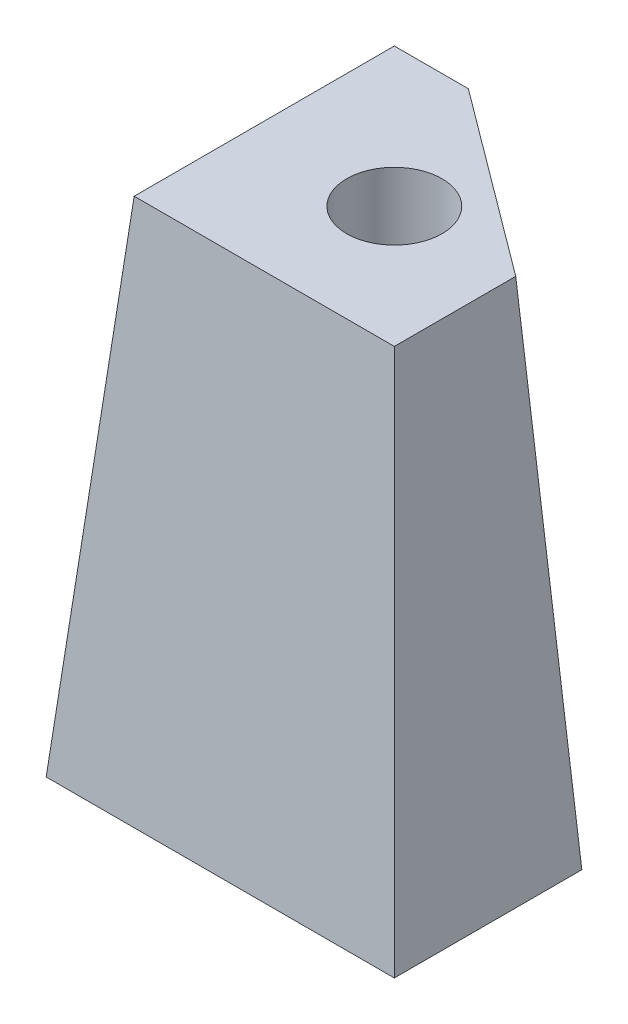
ISO-10303-21;
HEADER;
FILE_DESCRIPTION(('STEP AP214'),'2;1');
FILE_NAME('part.step','',(''),(''),'','','');
FILE_SCHEMA(('AUTOMOTIVE_DESIGN { 1 0 10303 214 1 1 1 1 }'));
ENDSEC;
DATA;
#1=APPLICATION_CONTEXT('core data for automotive mechanical design processes');
#2=APPLICATION_PROTOCOL_DEFINITION('international standard','automotive_design',2000,#1);
#3=PRODUCT_CONTEXT('',#1,'mechanical');
#4=PRODUCT('Part','Part','',(#3));
#5=PRODUCT_RELATED_PRODUCT_CATEGORY('part','',(#4));
#6=PRODUCT_DEFINITION_FORMATION('','',#4);
#7=PRODUCT_DEFINITION_CONTEXT('part definition',#1,'design');
#8=PRODUCT_DEFINITION('design','',#6,#7);
#9=PRODUCT_DEFINITION_SHAPE('','',#8);
#10=(LENGTH_UNIT() NAMED_UNIT(*) SI_UNIT(.MILLI.,.METRE.));
#11=(NAMED_UNIT(*) PLANE_ANGLE_UNIT() SI_UNIT($,.RADIAN.));
#12=(NAMED_UNIT(*) SI_UNIT($,.STERADIAN.) SOLID_ANGLE_UNIT());
#13=UNCERTAINTY_MEASURE_WITH_UNIT(LENGTH_MEASURE(1.E-05),#10,'distance_accuracy_value','');
#14=(GEOMETRIC_REPRESENTATION_CONTEXT(3) GLOBAL_UNCERTAINTY_ASSIGNED_CONTEXT((#13)) GLOBAL_UNIT_ASSIGNED_CONTEXT((#10,
#11,#12)) REPRESENTATION_CONTEXT('',''));
#15=CARTESIAN_POINT('',(0.,0.,0.));
#16=DIRECTION('',(0.,0.,1.));
#17=DIRECTION('',(1.,0.,0.));
#18=AXIS2_PLACEMENT_3D('',#15,#16,#17);
#19=CARTESIAN_POINT('',(-4.57964601769912,29.,-7.79867256637168));
#20=DIRECTION('',(0.,0.0871557427476584,-0.996194698091746));
#21=DIRECTION('',(0.,0.996194698091746,0.0871557427476584));
#22=AXIS2_PLACEMENT_3D('',#19,#20,#21);
#23=PLANE('',#22);
#24=DIRECTION('',(1.,0.,0.));
#25=VECTOR('',#24,1.);
#26=CARTESIAN_POINT('',(0.,0.,-10.3358438086235));
#27=LINE('',#26,#25);
#28=CARTESIAN_POINT('',(0.529076734468533,0.,-10.3358438086235));
#29=VERTEX_POINT('',#28);
#30=CARTESIAN_POINT('',(-7.11681725995092,0.,-10.3358438086235));
#31=VERTEX_POINT('',#30);
#32=EDGE_CURVE('E43',#29,#31,#27,.F.);
#33=ORIENTED_EDGE('',*,*,#32,.T.);
#34=DIRECTION('',(-0.0868265938642478,-0.992432509138967,-0.0868265938642478));
#35=VECTOR('',#34,1.);
#36=CARTESIAN_POINT('',(-4.46656315666811,30.2925430161303,-7.68558970534068));
#37=LINE('',#36,#35);
#38=CARTESIAN_POINT('',(-4.57964601769912,29.,-7.79867256637168));
#39=VERTEX_POINT('',#38);
#40=EDGE_CURVE('E11',#39,#31,#37,.T.);
#41=ORIENTED_EDGE('',*,*,#40,.F.);
#42=DIRECTION('',(-1.,0.,0.));
#43=VECTOR('',#42,1.);
#44=CARTESIAN_POINT('',(-4.57964601769912,29.,-7.79867256637168));
#45=LINE('',#44,#43);
#46=CARTESIAN_POINT('',(-0.312469404417813,29.,-7.79867256637168));
#47=VERTEX_POINT('',#46);
#48=EDGE_CURVE('E114',#47,#39,#45,.T.);
#49=ORIENTED_EDGE('',*,*,#48,.F.);
#50=DIRECTION('',(0.0288963352029624,-0.995778700850393,-0.087119347704982));
#51=VECTOR('',#50,1.);
#52=CARTESIAN_POINT('',(-0.316032489158469,29.1227852552634,-7.787930248488));
#53=LINE('',#52,#51);
#54=EDGE_CURVE('E92',#47,#29,#53,.T.);
#55=ORIENTED_EDGE('',*,*,#54,.T.);
#56=EDGE_LOOP('',(#33,#41,#49,#55));
#57=FACE_BOUND('',#56,.T.);
#58=ADVANCED_FACE('F39',(#57),#23,.T.);
#59=CARTESIAN_POINT('',(-4.57964601769912,29.,7.20132743362832));
#60=DIRECTION('',(-0.996194698091746,0.0871557427476584,0.));
#61=DIRECTION('',(0.0871557427476584,0.996194698091746,0.));
#62=AXIS2_PLACEMENT_3D('',#59,#60,#61);
#63=PLANE('',#62);
#64=DIRECTION('',(0.,0.,-1.));
#65=VECTOR('',#64,1.);
#66=CARTESIAN_POINT('',(-7.11681725995092,0.,0.));
#67=LINE('',#66,#65);
#68=CARTESIAN_POINT('',(-7.11681725995092,0.,9.73849867588012));
#69=VERTEX_POINT('',#68);
#70=EDGE_CURVE('E80',#31,#69,#67,.F.);
#71=ORIENTED_EDGE('',*,*,#70,.T.);
#72=DIRECTION('',(-0.0868265938642478,-0.992432509138967,0.0868265938642478));
#73=VECTOR('',#72,1.);
#74=CARTESIAN_POINT('',(-4.46656315666811,30.2925430161303,7.08824457259731));
#75=LINE('',#74,#73);
#76=CARTESIAN_POINT('',(-4.57964601769912,29.,7.20132743362832));
#77=VERTEX_POINT('',#76);
#78=EDGE_CURVE('E47',#77,#69,#75,.T.);
#79=ORIENTED_EDGE('',*,*,#78,.F.);
#80=DIRECTION('',(0.,0.,1.));
#81=VECTOR('',#80,1.);
#82=CARTESIAN_POINT('',(-4.57964601769912,29.,7.20132743362832));
#83=LINE('',#82,#81);
#84=EDGE_CURVE('E93',#39,#77,#83,.T.);
#85=ORIENTED_EDGE('',*,*,#84,.F.);
#86=ORIENTED_EDGE('',*,*,#40,.T.);
#87=EDGE_LOOP('',(#71,#79,#85,#86));
#88=FACE_BOUND('',#87,.T.);
#89=ADVANCED_FACE('F88',(#88),#63,.T.);
#90=CARTESIAN_POINT('',(10.4203539823009,29.,7.20132743362832));
#91=DIRECTION('',(0.,0.0871557427476584,0.996194698091746));
#92=DIRECTION('',(0.,0.996194698091746,-0.0871557427476584));
#93=AXIS2_PLACEMENT_3D('',#90,#91,#92);
#94=PLANE('',#93);
#95=DIRECTION('',(-1.,0.,0.));
#96=VECTOR('',#95,1.);
#97=CARTESIAN_POINT('',(0.,0.,9.73849867588012));
#98=LINE('',#97,#96);
#99=CARTESIAN_POINT('',(12.9575252245527,0.,9.73849867588012));
#100=VERTEX_POINT('',#99);
#101=EDGE_CURVE('E85',#69,#100,#98,.F.);
#102=ORIENTED_EDGE('',*,*,#101,.T.);
#103=DIRECTION('',(0.0868265938642478,-0.992432509138967,0.0868265938642478));
#104=VECTOR('',#103,1.);
#105=CARTESIAN_POINT('',(10.3675819804864,29.6031867408608,7.14855543181385));
#106=LINE('',#105,#104);
#107=CARTESIAN_POINT('',(10.4203539823009,29.,7.20132743362832));
#108=VERTEX_POINT('',#107);
#109=EDGE_CURVE('E129',#108,#100,#106,.T.);
#110=ORIENTED_EDGE('',*,*,#109,.F.);
#111=DIRECTION('',(1.,0.,0.));
#112=VECTOR('',#111,1.);
#113=CARTESIAN_POINT('',(10.4203539823009,29.,7.20132743362832));
#114=LINE('',#113,#112);
#115=EDGE_CURVE('E118',#77,#108,#114,.T.);
#116=ORIENTED_EDGE('',*,*,#115,.F.);
#117=ORIENTED_EDGE('',*,*,#78,.T.);
#118=EDGE_LOOP('',(#102,#110,#116,#117));
#119=FACE_BOUND('',#118,.T.);
#120=ADVANCED_FACE('F41',(#119),#94,.T.);
#121=CARTESIAN_POINT('',(10.4203539823009,29.,0.201327433628314));
#122=DIRECTION('',(0.996194698091746,0.0871557427476584,0.));
#123=DIRECTION('',(-0.0871557427476584,0.996194698091746,0.));
#124=AXIS2_PLACEMENT_3D('',#121,#122,#123);
#125=PLANE('',#124);
#126=DIRECTION('',(0.,0.,1.));
#127=VECTOR('',#126,1.);
#128=CARTESIAN_POINT('',(12.9575252245527,0.,0.));
#129=LINE('',#128,#127);
#130=CARTESIAN_POINT('',(12.9575252245527,0.,-1.0719638081653));
#131=VERTEX_POINT('',#130);
#132=EDGE_CURVE('E131',#100,#131,#129,.F.);
#133=ORIENTED_EDGE('',*,*,#132,.T.);
#134=DIRECTION('',(0.0870724913818913,-0.995243130626751,-0.0436977366097346));
#135=VECTOR('',#134,1.);
#136=CARTESIAN_POINT('',(10.3694207735681,29.5821692397634,0.226888502394943));
#137=LINE('',#136,#135);
#138=CARTESIAN_POINT('',(10.4203539823009,29.,0.201327433628314));
#139=VERTEX_POINT('',#138);
#140=EDGE_CURVE('E127',#139,#131,#137,.T.);
#141=ORIENTED_EDGE('',*,*,#140,.F.);
#142=DIRECTION('',(0.,0.,-1.));
#143=VECTOR('',#142,1.);
#144=CARTESIAN_POINT('',(10.4203539823009,29.,0.201327433628314));
#145=LINE('',#144,#143);
#146=EDGE_CURVE('E125',#108,#139,#145,.T.);
#147=ORIENTED_EDGE('',*,*,#146,.F.);
#148=ORIENTED_EDGE('',*,*,#109,.T.);
#149=EDGE_LOOP('',(#133,#141,#147,#148));
#150=FACE_BOUND('',#149,.T.);
#151=ADVANCED_FACE('F145',(#150),#125,.T.);
#152=CARTESIAN_POINT('',(-0.312469404417813,29.,-7.79867256637168));
#153=DIRECTION('',(0.595351002863312,0.0871557427476584,-0.798724645854723));
#154=DIRECTION('',(-0.0520864635693298,0.996194698091746,0.0698793517910468));
#155=AXIS2_PLACEMENT_3D('',#152,#153,#154);
#156=PLANE('',#155);
#157=DIRECTION('',(0.801775644243756,0.,0.597625146975519));
#158=VECTOR('',#157,1.);
#159=CARTESIAN_POINT('',(5.1414990569579,0.,-6.89785016516374));
#160=LINE('',#159,#158);
#161=EDGE_CURVE('E120',#131,#29,#160,.F.);
#162=ORIENTED_EDGE('',*,*,#161,.T.);
#163=ORIENTED_EDGE('',*,*,#54,.F.);
#164=DIRECTION('',(-0.801775644243756,0.,-0.597625146975519));
#165=VECTOR('',#164,1.);
#166=CARTESIAN_POINT('',(-0.312469404417813,29.,-7.79867256637168));
#167=LINE('',#166,#165);
#168=EDGE_CURVE('E59',#139,#47,#167,.T.);
#169=ORIENTED_EDGE('',*,*,#168,.F.);
#170=ORIENTED_EDGE('',*,*,#140,.T.);
#171=EDGE_LOOP('',(#162,#163,#169,#170));
#172=FACE_BOUND('',#171,.T.);
#173=ADVANCED_FACE('F143',(#172),#156,.T.);
#174=CARTESIAN_POINT('',(0.,29.,0.));
#175=DIRECTION('',(0.,-1.,0.));
#176=DIRECTION('',(0.,0.,-1.));
#177=AXIS2_PLACEMENT_3D('',#174,#175,#176);
#178=PLANE('',#177);
#179=CARTESIAN_POINT('',(3.42035398230088,29.,0.201327433628316));
#180=DIRECTION('',(0.,1.,0.));
#181=DIRECTION('',(0.,0.,1.));
#182=AXIS2_PLACEMENT_3D('',#179,#180,#181);
#183=CIRCLE('',#182,2.75);
#184=CARTESIAN_POINT('',(3.42035398230088,29.,2.95132743362832));
#185=VERTEX_POINT('',#184);
#186=EDGE_CURVE('E106',#185,#185,#183,.T.);
#187=ORIENTED_EDGE('',*,*,#186,.F.);
#188=EDGE_LOOP('',(#187));
#189=FACE_BOUND('',#188,.T.);
#190=ORIENTED_EDGE('',*,*,#48,.T.);
#191=ORIENTED_EDGE('',*,*,#84,.T.);
#192=ORIENTED_EDGE('',*,*,#115,.T.);
#193=ORIENTED_EDGE('',*,*,#146,.T.);
#194=ORIENTED_EDGE('',*,*,#168,.T.);
#195=EDGE_LOOP('',(#190,#191,#192,#193,#194));
#196=FACE_BOUND('',#195,.T.);
#197=ADVANCED_FACE('F146',(#189,#196),#178,.F.);
#198=CARTESIAN_POINT('',(0.,0.,0.));
#199=DIRECTION('',(0.,-1.,0.));
#200=DIRECTION('',(0.,0.,-1.));
#201=AXIS2_PLACEMENT_3D('',#198,#199,#200);
#202=PLANE('',#201);
#203=CARTESIAN_POINT('',(-0.579646017699118,0.,2.20132743362832));
#204=DIRECTION('',(0.,-1.,0.));
#205=DIRECTION('',(0.,0.,-1.));
#206=AXIS2_PLACEMENT_3D('',#203,#204,#205);
#207=CIRCLE('',#206,2.);
#208=CARTESIAN_POINT('',(-0.579646017699118,0.,0.201327433628316));
#209=VERTEX_POINT('',#208);
#210=EDGE_CURVE('E96',#209,#209,#207,.T.);
#211=ORIENTED_EDGE('',*,*,#210,.F.);
#212=EDGE_LOOP('',(#211));
#213=FACE_BOUND('',#212,.T.);
#214=CARTESIAN_POINT('',(7.42035398230088,0.,2.20132743362832));
#215=DIRECTION('',(0.,-1.,0.));
#216=DIRECTION('',(0.,0.,-1.));
#217=AXIS2_PLACEMENT_3D('',#214,#215,#216);
#218=CIRCLE('',#217,1.5);
#219=CARTESIAN_POINT('',(7.42035398230088,0.,0.701327433628317));
#220=VERTEX_POINT('',#219);
#221=EDGE_CURVE('E101',#220,#220,#218,.T.);
#222=ORIENTED_EDGE('',*,*,#221,.F.);
#223=EDGE_LOOP('',(#222));
#224=FACE_BOUND('',#223,.T.);
#225=ORIENTED_EDGE('',*,*,#32,.F.);
#226=ORIENTED_EDGE('',*,*,#161,.F.);
#227=ORIENTED_EDGE('',*,*,#132,.F.);
#228=ORIENTED_EDGE('',*,*,#101,.F.);
#229=ORIENTED_EDGE('',*,*,#70,.F.);
#230=EDGE_LOOP('',(#225,#226,#227,#228,#229));
#231=FACE_BOUND('',#230,.T.);
#232=ADVANCED_FACE('F76',(#213,#224,#231),#202,.T.);
#233=CARTESIAN_POINT('',(7.42035398230088,10.,2.20132743362832));
#234=DIRECTION('',(0.,-1.,0.));
#235=DIRECTION('',(0.,0.,-1.));
#236=AXIS2_PLACEMENT_3D('',#233,#234,#235);
#237=CYLINDRICAL_SURFACE('',#236,1.5);
#238=CARTESIAN_POINT('',(7.42035398230088,10.,2.20132743362832));
#239=DIRECTION('',(0.,-1.,0.));
#240=DIRECTION('',(0.,0.,-1.));
#241=AXIS2_PLACEMENT_3D('',#238,#239,#240);
#242=CIRCLE('',#241,1.5);
#243=CARTESIAN_POINT('',(7.42035398230088,10.,0.701327433628317));
#244=VERTEX_POINT('',#243);
#245=EDGE_CURVE('E111',#244,#244,#242,.T.);
#246=ORIENTED_EDGE('',*,*,#245,.F.);
#247=EDGE_LOOP('',(#246));
#248=FACE_BOUND('',#247,.T.);
#249=ORIENTED_EDGE('',*,*,#221,.T.);
#250=EDGE_LOOP('',(#249));
#251=FACE_BOUND('',#250,.T.);
#252=ADVANCED_FACE('F156',(#248,#251),#237,.F.);
#253=CARTESIAN_POINT('',(7.42035398230088,10.,2.20132743362832));
#254=DIRECTION('',(0.,-1.,0.));
#255=DIRECTION('',(0.,0.,-1.));
#256=AXIS2_PLACEMENT_3D('',#253,#254,#255);
#257=PLANE('',#256);
#258=ORIENTED_EDGE('',*,*,#245,.T.);
#259=EDGE_LOOP('',(#258));
#260=FACE_BOUND('',#259,.T.);
#261=ADVANCED_FACE('F213',(#260),#257,.T.);
#262=CARTESIAN_POINT('',(-0.579646017699118,10.,2.20132743362832));
#263=DIRECTION('',(0.,-1.,0.));
#264=DIRECTION('',(0.,0.,-1.));
#265=AXIS2_PLACEMENT_3D('',#262,#263,#264);
#266=CYLINDRICAL_SURFACE('',#265,2.);
#267=CARTESIAN_POINT('',(-0.579646017699118,10.,2.20132743362832));
#268=DIRECTION('',(0.,-1.,0.));
#269=DIRECTION('',(0.,0.,-1.));
#270=AXIS2_PLACEMENT_3D('',#267,#268,#269);
#271=CIRCLE('',#270,2.);
#272=CARTESIAN_POINT('',(-0.579646017699118,10.,0.201327433628316));
#273=VERTEX_POINT('',#272);
#274=EDGE_CURVE('E98',#273,#273,#271,.T.);
#275=ORIENTED_EDGE('',*,*,#274,.F.);
#276=EDGE_LOOP('',(#275));
#277=FACE_BOUND('',#276,.T.);
#278=ORIENTED_EDGE('',*,*,#210,.T.);
#279=EDGE_LOOP('',(#278));
#280=FACE_BOUND('',#279,.T.);
#281=ADVANCED_FACE('F224',(#277,#280),#266,.F.);
#282=CARTESIAN_POINT('',(-0.579646017699118,10.,2.20132743362832));
#283=DIRECTION('',(0.,-1.,0.));
#284=DIRECTION('',(0.,0.,-1.));
#285=AXIS2_PLACEMENT_3D('',#282,#283,#284);
#286=PLANE('',#285);
#287=ORIENTED_EDGE('',*,*,#274,.T.);
#288=EDGE_LOOP('',(#287));
#289=FACE_BOUND('',#288,.T.);
#290=ADVANCED_FACE('F235',(#289),#286,.T.);
#291=CARTESIAN_POINT('',(3.42035398230088,23.,0.201327433628316));
#292=DIRECTION('',(0.,1.,0.));
#293=DIRECTION('',(0.,0.,1.));
#294=AXIS2_PLACEMENT_3D('',#291,#292,#293);
#295=CYLINDRICAL_SURFACE('',#294,2.75);
#296=CARTESIAN_POINT('',(3.42035398230088,23.,0.201327433628316));
#297=DIRECTION('',(0.,1.,0.));
#298=DIRECTION('',(0.,0.,1.));
#299=AXIS2_PLACEMENT_3D('',#296,#297,#298);
#300=CIRCLE('',#299,2.75);
#301=CARTESIAN_POINT('',(3.42035398230088,23.,2.95132743362832));
#302=VERTEX_POINT('',#301);
#303=EDGE_CURVE('E112',#302,#302,#300,.T.);
#304=ORIENTED_EDGE('',*,*,#303,.F.);
#305=EDGE_LOOP('',(#304));
#306=FACE_BOUND('',#305,.T.);
#307=ORIENTED_EDGE('',*,*,#186,.T.);
#308=EDGE_LOOP('',(#307));
#309=FACE_BOUND('',#308,.T.);
#310=ADVANCED_FACE('F239',(#306,#309),#295,.F.);
#311=CARTESIAN_POINT('',(3.42035398230088,23.,0.201327433628316));
#312=DIRECTION('',(0.,1.,0.));
#313=DIRECTION('',(0.,0.,1.));
#314=AXIS2_PLACEMENT_3D('',#311,#312,#313);
#315=PLANE('',#314);
#316=ORIENTED_EDGE('',*,*,#303,.T.);
#317=EDGE_LOOP('',(#316));
#318=FACE_BOUND('',#317,.T.);
#319=ADVANCED_FACE('F250',(#318),#315,.T.);
#320=CLOSED_SHELL('',(#58,#89,#120,#151,#173,#197,#232,#252,#261,#281,#290,#310,#319));
#321=MANIFOLD_SOLID_BREP('B2',#320);
#322=ADVANCED_BREP_SHAPE_REPRESENTATION('',(#18,#321),#14);
#323=SHAPE_DEFINITION_REPRESENTATION(#9,#322);
ENDSEC;
END-ISO-10303-21;
